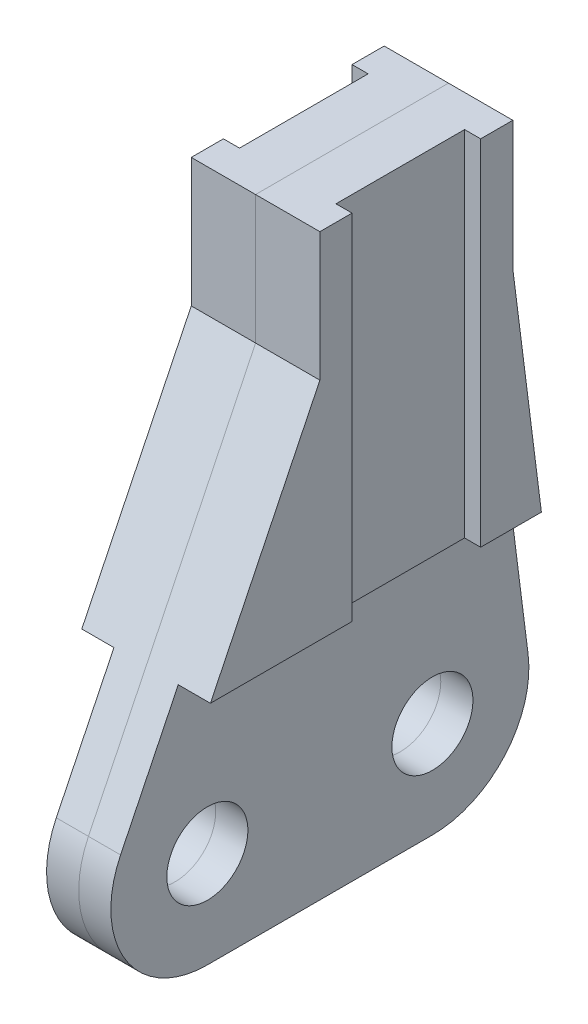
ISO-10303-21;
HEADER;
FILE_DESCRIPTION(('STEP AP214'),'2;1');
FILE_NAME('part.step','',(''),(''),'','','');
FILE_SCHEMA(('AUTOMOTIVE_DESIGN { 1 0 10303 214 1 1 1 1 }'));
ENDSEC;
DATA;
#1=APPLICATION_CONTEXT('core data for automotive mechanical design processes');
#2=APPLICATION_PROTOCOL_DEFINITION('international standard','automotive_design',2000,#1);
#3=PRODUCT_CONTEXT('',#1,'mechanical');
#4=PRODUCT('Part','Part','',(#3));
#5=PRODUCT_RELATED_PRODUCT_CATEGORY('part','',(#4));
#6=PRODUCT_DEFINITION_FORMATION('','',#4);
#7=PRODUCT_DEFINITION_CONTEXT('part definition',#1,'design');
#8=PRODUCT_DEFINITION('design','',#6,#7);
#9=PRODUCT_DEFINITION_SHAPE('','',#8);
#10=(LENGTH_UNIT() NAMED_UNIT(*) SI_UNIT(.MILLI.,.METRE.));
#11=(NAMED_UNIT(*) PLANE_ANGLE_UNIT() SI_UNIT($,.RADIAN.));
#12=(NAMED_UNIT(*) SI_UNIT($,.STERADIAN.) SOLID_ANGLE_UNIT());
#13=UNCERTAINTY_MEASURE_WITH_UNIT(LENGTH_MEASURE(1.E-05),#10,'distance_accuracy_value','');
#14=(GEOMETRIC_REPRESENTATION_CONTEXT(3) GLOBAL_UNCERTAINTY_ASSIGNED_CONTEXT((#13)) GLOBAL_UNIT_ASSIGNED_CONTEXT((#10,
#11,#12)) REPRESENTATION_CONTEXT('',''));
#15=CARTESIAN_POINT('',(0.,0.,0.));
#16=DIRECTION('',(0.,0.,1.));
#17=DIRECTION('',(1.,0.,0.));
#18=AXIS2_PLACEMENT_3D('',#15,#16,#17);
#19=CARTESIAN_POINT('',(-12.7,0.,0.));
#20=DIRECTION('',(-1.,0.,0.));
#21=DIRECTION('',(0.,0.,-1.));
#22=AXIS2_PLACEMENT_3D('',#19,#20,#21);
#23=PLANE('',#22);
#24=DIRECTION('',(0.,-1.,0.));
#25=VECTOR('',#24,1.);
#26=CARTESIAN_POINT('',(-12.7,0.,0.));
#27=LINE('',#26,#25);
#28=CARTESIAN_POINT('',(-12.7,60.3249999999986,0.));
#29=VERTEX_POINT('',#28);
#30=CARTESIAN_POINT('',(-12.7,-9.52500000000001,0.));
#31=VERTEX_POINT('',#30);
#32=EDGE_CURVE('E181',#29,#31,#27,.T.);
#33=ORIENTED_EDGE('',*,*,#32,.T.);
#34=DIRECTION('',(0.,0.,-1.));
#35=VECTOR('',#34,1.);
#36=CARTESIAN_POINT('',(-12.7,-9.52500000000001,0.));
#37=LINE('',#36,#35);
#38=CARTESIAN_POINT('',(-12.7,-9.52500000000001,27.9673826489299));
#39=VERTEX_POINT('',#38);
#40=EDGE_CURVE('E12',#39,#31,#37,.T.);
#41=ORIENTED_EDGE('',*,*,#40,.F.);
#42=DIRECTION('',(0.,-0.899290328705867,0.437352151813722));
#43=VECTOR('',#42,1.);
#44=CARTESIAN_POINT('',(-12.7,9.17784255482599,18.8716232759169));
#45=LINE('',#44,#43);
#46=CARTESIAN_POINT('',(-12.7,34.9249999999986,6.34999999999709));
#47=VERTEX_POINT('',#46);
#48=EDGE_CURVE('E227',#47,#39,#45,.T.);
#49=ORIENTED_EDGE('',*,*,#48,.F.);
#50=DIRECTION('',(0.,-1.,0.));
#51=VECTOR('',#50,1.);
#52=CARTESIAN_POINT('',(-12.7,0.,6.34999999999709));
#53=LINE('',#52,#51);
#54=CARTESIAN_POINT('',(-12.7,60.3249999999986,6.3499999999971));
#55=VERTEX_POINT('',#54);
#56=EDGE_CURVE('E224',#55,#47,#53,.T.);
#57=ORIENTED_EDGE('',*,*,#56,.F.);
#58=DIRECTION('',(0.,0.,-1.));
#59=VECTOR('',#58,1.);
#60=CARTESIAN_POINT('',(-12.7,60.3249999999986,0.));
#61=LINE('',#60,#59);
#62=EDGE_CURVE('E221',#55,#29,#61,.T.);
#63=ORIENTED_EDGE('',*,*,#62,.T.);
#64=EDGE_LOOP('',(#33,#41,#49,#57,#63));
#65=FACE_BOUND('',#64,.T.);
#66=ADVANCED_FACE('F54',(#65),#23,.T.);
#67=CARTESIAN_POINT('',(-12.7,4.52293344157861,-35.611315475034));
#68=DIRECTION('',(0.,0.125996158832205,-0.992030729342357));
#69=DIRECTION('',(0.,0.992030729342358,0.125996158832205));
#70=AXIS2_PLACEMENT_3D('',#67,#68,#69);
#71=PLANE('',#70);
#72=DIRECTION('',(0.,-0.992030729342358,-0.125996158832205));
#73=VECTOR('',#72,1.);
#74=CARTESIAN_POINT('',(-12.7,4.52293344157861,-35.611315475034));
#75=LINE('',#74,#73);
#76=CARTESIAN_POINT('',(-12.7,34.9249999999986,-31.7499999999969));
#77=VERTEX_POINT('',#76);
#78=CARTESIAN_POINT('',(-12.7,-9.52500000000001,-37.3955199364651));
#79=VERTEX_POINT('',#78);
#80=EDGE_CURVE('E214',#77,#79,#75,.T.);
#81=ORIENTED_EDGE('',*,*,#80,.F.);
#82=DIRECTION('',(1.,0.,0.));
#83=VECTOR('',#82,1.);
#84=CARTESIAN_POINT('',(-12.7,34.9249999999986,-31.7499999999969));
#85=LINE('',#84,#83);
#86=CARTESIAN_POINT('',(0.,34.9249999999986,-31.7499999999969));
#87=VERTEX_POINT('',#86);
#88=EDGE_CURVE('E268',#77,#87,#85,.T.);
#89=ORIENTED_EDGE('',*,*,#88,.T.);
#90=DIRECTION('',(0.,-0.992030729342358,-0.125996158832205));
#91=VECTOR('',#90,1.);
#92=CARTESIAN_POINT('',(0.,4.52293344157861,-35.611315475034));
#93=LINE('',#92,#91);
#94=CARTESIAN_POINT('',(0.,-38.8747731742469,-41.1231853939687));
#95=VERTEX_POINT('',#94);
#96=EDGE_CURVE('E235',#87,#95,#93,.T.);
#97=ORIENTED_EDGE('',*,*,#96,.T.);
#98=DIRECTION('',(1.,0.,0.));
#99=VECTOR('',#98,1.);
#100=CARTESIAN_POINT('',(-12.7,-38.8747731742469,-41.1231853939687));
#101=LINE('',#100,#99);
#102=CARTESIAN_POINT('',(-6.35,-38.8747731742469,-41.1231853939687));
#103=VERTEX_POINT('',#102);
#104=EDGE_CURVE('E271',#103,#95,#101,.T.);
#105=ORIENTED_EDGE('',*,*,#104,.F.);
#106=DIRECTION('',(0.,0.992030729342358,0.125996158832205));
#107=VECTOR('',#106,1.);
#108=CARTESIAN_POINT('',(-6.35,4.52293344157861,-35.611315475034));
#109=LINE('',#108,#107);
#110=CARTESIAN_POINT('',(-6.35,-9.52500000000001,-37.3955199364651));
#111=VERTEX_POINT('',#110);
#112=EDGE_CURVE('E207',#103,#111,#109,.T.);
#113=ORIENTED_EDGE('',*,*,#112,.T.);
#114=DIRECTION('',(1.,0.,0.));
#115=VECTOR('',#114,1.);
#116=CARTESIAN_POINT('',(-12.7,-9.52500000000001,-37.3955199364651));
#117=LINE('',#116,#115);
#118=EDGE_CURVE('E194',#79,#111,#117,.T.);
#119=ORIENTED_EDGE('',*,*,#118,.F.);
#120=EDGE_LOOP('',(#81,#89,#97,#105,#113,#119));
#121=FACE_BOUND('',#120,.T.);
#122=ADVANCED_FACE('F317',(#121),#71,.T.);
#123=CARTESIAN_POINT('',(-12.7,9.17784255482599,18.8716232759169));
#124=DIRECTION('',(0.,-0.437352151813722,-0.899290328705867));
#125=DIRECTION('',(0.,0.899290328705867,-0.437352151813722));
#126=AXIS2_PLACEMENT_3D('',#123,#124,#125);
#127=PLANE('',#126);
#128=DIRECTION('',(1.,0.,0.));
#129=VECTOR('',#128,1.);
#130=CARTESIAN_POINT('',(-12.7,-9.52500000000001,27.9673826489299));
#131=LINE('',#130,#129);
#132=CARTESIAN_POINT('',(-6.35,-9.52500000000002,27.9673826489299));
#133=VERTEX_POINT('',#132);
#134=EDGE_CURVE('E191',#39,#133,#131,.T.);
#135=ORIENTED_EDGE('',*,*,#134,.T.);
#136=DIRECTION('',(0.,0.899290328705867,-0.437352151813722));
#137=VECTOR('',#136,1.);
#138=CARTESIAN_POINT('',(-6.35,9.17784255482599,18.8716232759169));
#139=LINE('',#138,#137);
#140=CARTESIAN_POINT('',(-6.35,-32.94344150795,39.3564807618438));
#141=VERTEX_POINT('',#140);
#142=EDGE_CURVE('E199',#141,#133,#139,.T.);
#143=ORIENTED_EDGE('',*,*,#142,.F.);
#144=DIRECTION('',(1.,0.,0.));
#145=VECTOR('',#144,1.);
#146=CARTESIAN_POINT('',(-12.7,-32.94344150795,39.3564807618438));
#147=LINE('',#146,#145);
#148=CARTESIAN_POINT('',(0.,-32.94344150795,39.3564807618438));
#149=VERTEX_POINT('',#148);
#150=EDGE_CURVE('E256',#141,#149,#147,.T.);
#151=ORIENTED_EDGE('',*,*,#150,.T.);
#152=DIRECTION('',(0.,-0.899290328705867,0.437352151813722));
#153=VECTOR('',#152,1.);
#154=CARTESIAN_POINT('',(0.,9.17784255482599,18.8716232759169));
#155=LINE('',#154,#153);
#156=CARTESIAN_POINT('',(0.,34.9249999999986,6.34999999999709));
#157=VERTEX_POINT('',#156);
#158=EDGE_CURVE('E244',#157,#149,#155,.T.);
#159=ORIENTED_EDGE('',*,*,#158,.F.);
#160=DIRECTION('',(1.,0.,0.));
#161=VECTOR('',#160,1.);
#162=CARTESIAN_POINT('',(-12.7,34.9249999999986,6.34999999999709));
#163=LINE('',#162,#161);
#164=EDGE_CURVE('E259',#47,#157,#163,.T.);
#165=ORIENTED_EDGE('',*,*,#164,.F.);
#166=ORIENTED_EDGE('',*,*,#48,.T.);
#167=EDGE_LOOP('',(#135,#143,#151,#159,#165,#166));
#168=FACE_BOUND('',#167,.T.);
#169=ADVANCED_FACE('F323',(#168),#127,.F.);
#170=DIRECTION('',(0.,1.,0.));
#171=VECTOR('',#170,1.);
#172=CARTESIAN_POINT('',(-12.7,0.,-25.3999999999969));
#173=LINE('',#172,#171);
#174=CARTESIAN_POINT('',(-12.7,-9.52500000000001,-25.3999999999969));
#175=VERTEX_POINT('',#174);
#176=CARTESIAN_POINT('',(-12.7,60.3249999999986,-25.3999999999969));
#177=VERTEX_POINT('',#176);
#178=EDGE_CURVE('E171',#175,#177,#173,.T.);
#179=ORIENTED_EDGE('',*,*,#178,.T.);
#180=CARTESIAN_POINT('',(-12.7,60.3249999999986,-31.7499999999969));
#181=VERTEX_POINT('',#180);
#182=EDGE_CURVE('E220',#177,#181,#61,.T.);
#183=ORIENTED_EDGE('',*,*,#182,.T.);
#184=DIRECTION('',(0.,-1.,0.));
#185=VECTOR('',#184,1.);
#186=CARTESIAN_POINT('',(-12.7,0.,-31.7499999999969));
#187=LINE('',#186,#185);
#188=EDGE_CURVE('E217',#181,#77,#187,.T.);
#189=ORIENTED_EDGE('',*,*,#188,.T.);
#190=ORIENTED_EDGE('',*,*,#80,.T.);
#191=EDGE_CURVE('E63',#175,#79,#37,.T.);
#192=ORIENTED_EDGE('',*,*,#191,.F.);
#193=EDGE_LOOP('',(#179,#183,#189,#190,#192));
#194=FACE_BOUND('',#193,.T.);
#195=ADVANCED_FACE('F320',(#194),#23,.T.);
#196=CARTESIAN_POINT('',(-12.7,-60.3249999999968,0.));
#197=DIRECTION('',(0.,1.,0.));
#198=DIRECTION('',(0.,0.,1.));
#199=AXIS2_PLACEMENT_3D('',#196,#197,#198);
#200=PLANE('',#199);
#201=DIRECTION('',(1.,0.,0.));
#202=VECTOR('',#201,1.);
#203=CARTESIAN_POINT('',(-12.7,-60.3249999999968,-22.225));
#204=LINE('',#203,#202);
#205=CARTESIAN_POINT('',(-6.35,-60.3249999999968,-22.225));
#206=VERTEX_POINT('',#205);
#207=CARTESIAN_POINT('',(0.,-60.3249999999968,-22.225));
#208=VERTEX_POINT('',#207);
#209=EDGE_CURVE('E274',#206,#208,#204,.T.);
#210=ORIENTED_EDGE('',*,*,#209,.T.);
#211=DIRECTION('',(0.,0.,-1.));
#212=VECTOR('',#211,1.);
#213=CARTESIAN_POINT('',(0.,-60.3249999999968,0.));
#214=LINE('',#213,#212);
#215=CARTESIAN_POINT('',(0.,-60.3249999999968,22.225));
#216=VERTEX_POINT('',#215);
#217=EDGE_CURVE('E213',#216,#208,#214,.T.);
#218=ORIENTED_EDGE('',*,*,#217,.F.);
#219=DIRECTION('',(1.,0.,0.));
#220=VECTOR('',#219,1.);
#221=CARTESIAN_POINT('',(-12.7,-60.3249999999968,22.225));
#222=LINE('',#221,#220);
#223=CARTESIAN_POINT('',(-6.35,-60.3249999999968,22.225));
#224=VERTEX_POINT('',#223);
#225=EDGE_CURVE('E230',#224,#216,#222,.T.);
#226=ORIENTED_EDGE('',*,*,#225,.F.);
#227=DIRECTION('',(0.,0.,1.));
#228=VECTOR('',#227,1.);
#229=CARTESIAN_POINT('',(-6.35,-60.3249999999968,0.));
#230=LINE('',#229,#228);
#231=EDGE_CURVE('E202',#206,#224,#230,.T.);
#232=ORIENTED_EDGE('',*,*,#231,.F.);
#233=EDGE_LOOP('',(#210,#218,#226,#232));
#234=FACE_BOUND('',#233,.T.);
#235=ADVANCED_FACE('F56',(#234),#200,.F.);
#236=CARTESIAN_POINT('',(-12.7,-41.275,-22.2250000000001));
#237=DIRECTION('',(1.,0.,0.));
#238=DIRECTION('',(0.,0.,1.));
#239=AXIS2_PLACEMENT_3D('',#236,#237,#238);
#240=CYLINDRICAL_SURFACE('',#239,19.0499999999968);
#241=ORIENTED_EDGE('',*,*,#104,.T.);
#242=CARTESIAN_POINT('',(0.,-41.275,-22.2250000000001));
#243=DIRECTION('',(1.,0.,0.));
#244=DIRECTION('',(0.,0.,-1.));
#245=AXIS2_PLACEMENT_3D('',#242,#243,#244);
#246=CIRCLE('',#245,19.0499999999968);
#247=EDGE_CURVE('E233',#208,#95,#246,.T.);
#248=ORIENTED_EDGE('',*,*,#247,.F.);
#249=ORIENTED_EDGE('',*,*,#209,.F.);
#250=CARTESIAN_POINT('',(-6.35,-41.275,-22.2250000000001));
#251=DIRECTION('',(-1.,0.,0.));
#252=DIRECTION('',(0.,0.,1.));
#253=AXIS2_PLACEMENT_3D('',#250,#251,#252);
#254=CIRCLE('',#253,19.0499999999968);
#255=EDGE_CURVE('E205',#103,#206,#254,.T.);
#256=ORIENTED_EDGE('',*,*,#255,.F.);
#257=EDGE_LOOP('',(#241,#248,#249,#256));
#258=FACE_BOUND('',#257,.T.);
#259=ADVANCED_FACE('F332',(#258),#240,.T.);
#260=CARTESIAN_POINT('',(-12.7,0.,-31.7499999999969));
#261=DIRECTION('',(0.,0.,-1.));
#262=DIRECTION('',(1.,0.,0.));
#263=AXIS2_PLACEMENT_3D('',#260,#261,#262);
#264=PLANE('',#263);
#265=DIRECTION('',(0.,-1.,0.));
#266=VECTOR('',#265,1.);
#267=CARTESIAN_POINT('',(0.,0.,-31.7499999999969));
#268=LINE('',#267,#266);
#269=CARTESIAN_POINT('',(0.,60.3249999999986,-31.7499999999969));
#270=VERTEX_POINT('',#269);
#271=EDGE_CURVE('E238',#270,#87,#268,.T.);
#272=ORIENTED_EDGE('',*,*,#271,.T.);
#273=ORIENTED_EDGE('',*,*,#88,.F.);
#274=ORIENTED_EDGE('',*,*,#188,.F.);
#275=DIRECTION('',(1.,0.,0.));
#276=VECTOR('',#275,1.);
#277=CARTESIAN_POINT('',(-12.7,60.3249999999986,-31.7499999999969));
#278=LINE('',#277,#276);
#279=EDGE_CURVE('E265',#181,#270,#278,.T.);
#280=ORIENTED_EDGE('',*,*,#279,.T.);
#281=EDGE_LOOP('',(#272,#273,#274,#280));
#282=FACE_BOUND('',#281,.T.);
#283=ADVANCED_FACE('F360',(#282),#264,.T.);
#284=CARTESIAN_POINT('',(-12.7,60.3249999999986,0.));
#285=DIRECTION('',(0.,1.,0.));
#286=DIRECTION('',(0.,0.,1.));
#287=AXIS2_PLACEMENT_3D('',#284,#285,#286);
#288=PLANE('',#287);
#289=DIRECTION('',(-1.,0.,0.));
#290=VECTOR('',#289,1.);
#291=CARTESIAN_POINT('',(-9.525,60.3249999999986,0.));
#292=LINE('',#291,#290);
#293=CARTESIAN_POINT('',(-9.525,60.3249999999986,0.));
#294=VERTEX_POINT('',#293);
#295=EDGE_CURVE('E185',#294,#29,#292,.T.);
#296=ORIENTED_EDGE('',*,*,#295,.T.);
#297=ORIENTED_EDGE('',*,*,#62,.F.);
#298=DIRECTION('',(1.,0.,0.));
#299=VECTOR('',#298,1.);
#300=CARTESIAN_POINT('',(-12.7,60.3249999999986,6.3499999999971));
#301=LINE('',#300,#299);
#302=CARTESIAN_POINT('',(0.,60.3249999999986,6.3499999999971));
#303=VERTEX_POINT('',#302);
#304=EDGE_CURVE('E262',#55,#303,#301,.T.);
#305=ORIENTED_EDGE('',*,*,#304,.T.);
#306=DIRECTION('',(0.,0.,-1.));
#307=VECTOR('',#306,1.);
#308=CARTESIAN_POINT('',(0.,60.3249999999986,0.));
#309=LINE('',#308,#307);
#310=EDGE_CURVE('E240',#303,#270,#309,.T.);
#311=ORIENTED_EDGE('',*,*,#310,.T.);
#312=ORIENTED_EDGE('',*,*,#279,.F.);
#313=ORIENTED_EDGE('',*,*,#182,.F.);
#314=DIRECTION('',(-1.,0.,0.));
#315=VECTOR('',#314,1.);
#316=CARTESIAN_POINT('',(-9.525,60.3249999999986,-25.3999999999969));
#317=LINE('',#316,#315);
#318=CARTESIAN_POINT('',(-9.525,60.3249999999986,-25.3999999999969));
#319=VERTEX_POINT('',#318);
#320=EDGE_CURVE('E172',#319,#177,#317,.T.);
#321=ORIENTED_EDGE('',*,*,#320,.F.);
#322=DIRECTION('',(0.,0.,1.));
#323=VECTOR('',#322,1.);
#324=CARTESIAN_POINT('',(-9.525,60.3249999999986,0.));
#325=LINE('',#324,#323);
#326=EDGE_CURVE('E163',#319,#294,#325,.T.);
#327=ORIENTED_EDGE('',*,*,#326,.T.);
#328=EDGE_LOOP('',(#296,#297,#305,#311,#312,#313,#321,#327));
#329=FACE_BOUND('',#328,.T.);
#330=ADVANCED_FACE('F356',(#329),#288,.T.);
#331=CARTESIAN_POINT('',(-12.7,0.,6.34999999999709));
#332=DIRECTION('',(0.,0.,-1.));
#333=DIRECTION('',(0.,1.,0.));
#334=AXIS2_PLACEMENT_3D('',#331,#332,#333);
#335=PLANE('',#334);
#336=DIRECTION('',(0.,-1.,0.));
#337=VECTOR('',#336,1.);
#338=CARTESIAN_POINT('',(0.,0.,6.34999999999709));
#339=LINE('',#338,#337);
#340=EDGE_CURVE('E242',#303,#157,#339,.T.);
#341=ORIENTED_EDGE('',*,*,#340,.F.);
#342=ORIENTED_EDGE('',*,*,#304,.F.);
#343=ORIENTED_EDGE('',*,*,#56,.T.);
#344=ORIENTED_EDGE('',*,*,#164,.T.);
#345=EDGE_LOOP('',(#341,#342,#343,#344));
#346=FACE_BOUND('',#345,.T.);
#347=ADVANCED_FACE('F367',(#346),#335,.F.);
#348=CARTESIAN_POINT('',(-12.7,-41.275,22.225));
#349=DIRECTION('',(1.,0.,0.));
#350=DIRECTION('',(0.,0.,1.));
#351=AXIS2_PLACEMENT_3D('',#348,#349,#350);
#352=CYLINDRICAL_SURFACE('',#351,8.00099999999679);
#353=CARTESIAN_POINT('',(-6.35,-41.275,22.225));
#354=DIRECTION('',(-1.,0.,0.));
#355=DIRECTION('',(0.,0.,1.));
#356=AXIS2_PLACEMENT_3D('',#353,#354,#355);
#357=CIRCLE('',#356,8.00099999999679);
#358=CARTESIAN_POINT('',(-6.35,-41.275,30.2259999999968));
#359=VERTEX_POINT('',#358);
#360=EDGE_CURVE('E210',#359,#359,#357,.T.);
#361=ORIENTED_EDGE('',*,*,#360,.T.);
#362=EDGE_LOOP('',(#361));
#363=FACE_BOUND('',#362,.T.);
#364=CARTESIAN_POINT('',(0.,-41.275,22.225));
#365=DIRECTION('',(1.,0.,0.));
#366=DIRECTION('',(0.,0.,-1.));
#367=AXIS2_PLACEMENT_3D('',#364,#365,#366);
#368=CIRCLE('',#367,8.00099999999679);
#369=CARTESIAN_POINT('',(0.,-41.275,14.2240000000032));
#370=VERTEX_POINT('',#369);
#371=EDGE_CURVE('E249',#370,#370,#368,.T.);
#372=ORIENTED_EDGE('',*,*,#371,.T.);
#373=EDGE_LOOP('',(#372));
#374=FACE_BOUND('',#373,.T.);
#375=ADVANCED_FACE('F312',(#363,#374),#352,.F.);
#376=CARTESIAN_POINT('',(-12.7,-41.275,22.225));
#377=DIRECTION('',(1.,0.,0.));
#378=DIRECTION('',(0.,0.,1.));
#379=AXIS2_PLACEMENT_3D('',#376,#377,#378);
#380=CYLINDRICAL_SURFACE('',#379,19.0499999999968);
#381=ORIENTED_EDGE('',*,*,#225,.T.);
#382=CARTESIAN_POINT('',(0.,-41.275,22.225));
#383=DIRECTION('',(1.,0.,0.));
#384=DIRECTION('',(0.,0.,-1.));
#385=AXIS2_PLACEMENT_3D('',#382,#383,#384);
#386=CIRCLE('',#385,19.0499999999968);
#387=EDGE_CURVE('E247',#149,#216,#386,.T.);
#388=ORIENTED_EDGE('',*,*,#387,.F.);
#389=ORIENTED_EDGE('',*,*,#150,.F.);
#390=CARTESIAN_POINT('',(-6.35,-41.275,22.225));
#391=DIRECTION('',(-1.,0.,0.));
#392=DIRECTION('',(0.,0.,1.));
#393=AXIS2_PLACEMENT_3D('',#390,#391,#392);
#394=CIRCLE('',#393,19.0499999999968);
#395=EDGE_CURVE('E197',#224,#141,#394,.T.);
#396=ORIENTED_EDGE('',*,*,#395,.F.);
#397=EDGE_LOOP('',(#381,#388,#389,#396));
#398=FACE_BOUND('',#397,.T.);
#399=ADVANCED_FACE('F307',(#398),#380,.T.);
#400=CARTESIAN_POINT('',(-12.7,-41.275,-22.2250000000001));
#401=DIRECTION('',(1.,0.,0.));
#402=DIRECTION('',(0.,0.,1.));
#403=AXIS2_PLACEMENT_3D('',#400,#401,#402);
#404=CYLINDRICAL_SURFACE('',#403,8.00099999999679);
#405=CARTESIAN_POINT('',(-6.35,-41.275,-22.2250000000001));
#406=DIRECTION('',(-1.,0.,0.));
#407=DIRECTION('',(0.,0.,1.));
#408=AXIS2_PLACEMENT_3D('',#405,#406,#407);
#409=CIRCLE('',#408,8.00099999999679);
#410=CARTESIAN_POINT('',(-6.35,-41.275,-14.2240000000033));
#411=VERTEX_POINT('',#410);
#412=EDGE_CURVE('E196',#411,#411,#409,.T.);
#413=ORIENTED_EDGE('',*,*,#412,.T.);
#414=EDGE_LOOP('',(#413));
#415=FACE_BOUND('',#414,.T.);
#416=CARTESIAN_POINT('',(0.,-41.275,-22.2250000000001));
#417=DIRECTION('',(1.,0.,0.));
#418=DIRECTION('',(0.,0.,-1.));
#419=AXIS2_PLACEMENT_3D('',#416,#417,#418);
#420=CIRCLE('',#419,8.00099999999679);
#421=CARTESIAN_POINT('',(0.,-41.275,-30.2259999999968));
#422=VERTEX_POINT('',#421);
#423=EDGE_CURVE('E218',#422,#422,#420,.T.);
#424=ORIENTED_EDGE('',*,*,#423,.T.);
#425=EDGE_LOOP('',(#424));
#426=FACE_BOUND('',#425,.T.);
#427=ADVANCED_FACE('F297',(#415,#426),#404,.F.);
#428=CARTESIAN_POINT('',(0.,0.,0.));
#429=DIRECTION('',(-1.,0.,0.));
#430=DIRECTION('',(0.,0.,-1.));
#431=AXIS2_PLACEMENT_3D('',#428,#429,#430);
#432=PLANE('',#431);
#433=CARTESIAN_POINT('',(0.,9.52499999999857,-12.6999999999999));
#434=DIRECTION('',(1.,0.,0.));
#435=DIRECTION('',(0.,0.,-1.));
#436=AXIS2_PLACEMENT_3D('',#433,#434,#435);
#437=CIRCLE('',#436,6.5484375);
#438=CARTESIAN_POINT('',(0.,9.52499999999857,-19.2484374999999));
#439=VERTEX_POINT('',#438);
#440=EDGE_CURVE('E280',#439,#439,#437,.T.);
#441=ORIENTED_EDGE('',*,*,#440,.F.);
#442=EDGE_LOOP('',(#441));
#443=FACE_BOUND('',#442,.T.);
#444=CARTESIAN_POINT('',(0.,47.6249999999986,-12.6999999999999));
#445=DIRECTION('',(1.,0.,0.));
#446=DIRECTION('',(0.,0.,-1.));
#447=AXIS2_PLACEMENT_3D('',#444,#445,#446);
#448=CIRCLE('',#447,6.5484375);
#449=CARTESIAN_POINT('',(0.,47.6249999999986,-19.2484374999999));
#450=VERTEX_POINT('',#449);
#451=EDGE_CURVE('E285',#450,#450,#448,.T.);
#452=ORIENTED_EDGE('',*,*,#451,.F.);
#453=EDGE_LOOP('',(#452));
#454=FACE_BOUND('',#453,.T.);
#455=ORIENTED_EDGE('',*,*,#217,.T.);
#456=ORIENTED_EDGE('',*,*,#247,.T.);
#457=ORIENTED_EDGE('',*,*,#96,.F.);
#458=ORIENTED_EDGE('',*,*,#271,.F.);
#459=ORIENTED_EDGE('',*,*,#310,.F.);
#460=ORIENTED_EDGE('',*,*,#340,.T.);
#461=ORIENTED_EDGE('',*,*,#158,.T.);
#462=ORIENTED_EDGE('',*,*,#387,.T.);
#463=EDGE_LOOP('',(#455,#456,#457,#458,#459,#460,#461,#462));
#464=FACE_BOUND('',#463,.T.);
#465=ORIENTED_EDGE('',*,*,#371,.F.);
#466=EDGE_LOOP('',(#465));
#467=FACE_BOUND('',#466,.T.);
#468=ORIENTED_EDGE('',*,*,#423,.F.);
#469=EDGE_LOOP('',(#468));
#470=FACE_BOUND('',#469,.T.);
#471=ADVANCED_FACE('F294',(#443,#454,#464,#467,#470),#432,.F.);
#472=CARTESIAN_POINT('',(-6.35,-9.52500000000001,63.9630765571107));
#473=DIRECTION('',(0.,-1.,0.));
#474=DIRECTION('',(0.,0.,-1.));
#475=AXIS2_PLACEMENT_3D('',#472,#473,#474);
#476=PLANE('',#475);
#477=DIRECTION('',(-1.,0.,0.));
#478=VECTOR('',#477,1.);
#479=CARTESIAN_POINT('',(-9.525,-9.52500000000001,0.));
#480=LINE('',#479,#478);
#481=CARTESIAN_POINT('',(-9.525,-9.52500000000001,0.));
#482=VERTEX_POINT('',#481);
#483=EDGE_CURVE('E173',#482,#31,#480,.T.);
#484=ORIENTED_EDGE('',*,*,#483,.F.);
#485=DIRECTION('',(0.,0.,-1.));
#486=VECTOR('',#485,1.);
#487=CARTESIAN_POINT('',(-9.525,-9.52500000000001,0.));
#488=LINE('',#487,#486);
#489=CARTESIAN_POINT('',(-9.525,-9.52500000000001,-25.3999999999969));
#490=VERTEX_POINT('',#489);
#491=EDGE_CURVE('E160',#482,#490,#488,.T.);
#492=ORIENTED_EDGE('',*,*,#491,.T.);
#493=DIRECTION('',(-1.,0.,0.));
#494=VECTOR('',#493,1.);
#495=CARTESIAN_POINT('',(-9.525,-9.52500000000001,-25.3999999999969));
#496=LINE('',#495,#494);
#497=EDGE_CURVE('E168',#490,#175,#496,.T.);
#498=ORIENTED_EDGE('',*,*,#497,.T.);
#499=ORIENTED_EDGE('',*,*,#191,.T.);
#500=ORIENTED_EDGE('',*,*,#118,.T.);
#501=DIRECTION('',(0.,0.,-1.));
#502=VECTOR('',#501,1.);
#503=CARTESIAN_POINT('',(-6.35,-9.52500000000001,63.9630765571107));
#504=LINE('',#503,#502);
#505=EDGE_CURVE('E187',#133,#111,#504,.T.);
#506=ORIENTED_EDGE('',*,*,#505,.F.);
#507=ORIENTED_EDGE('',*,*,#134,.F.);
#508=ORIENTED_EDGE('',*,*,#40,.T.);
#509=EDGE_LOOP('',(#484,#492,#498,#499,#500,#506,#507,#508));
#510=FACE_BOUND('',#509,.T.);
#511=ADVANCED_FACE('F175',(#510),#476,.T.);
#512=CARTESIAN_POINT('',(-6.35,0.,0.));
#513=DIRECTION('',(1.,0.,0.));
#514=DIRECTION('',(0.,0.,1.));
#515=AXIS2_PLACEMENT_3D('',#512,#513,#514);
#516=PLANE('',#515);
#517=ORIENTED_EDGE('',*,*,#360,.F.);
#518=EDGE_LOOP('',(#517));
#519=FACE_BOUND('',#518,.T.);
#520=ORIENTED_EDGE('',*,*,#112,.F.);
#521=ORIENTED_EDGE('',*,*,#255,.T.);
#522=ORIENTED_EDGE('',*,*,#231,.T.);
#523=ORIENTED_EDGE('',*,*,#395,.T.);
#524=ORIENTED_EDGE('',*,*,#142,.T.);
#525=ORIENTED_EDGE('',*,*,#505,.T.);
#526=EDGE_LOOP('',(#520,#521,#522,#523,#524,#525));
#527=FACE_BOUND('',#526,.T.);
#528=ORIENTED_EDGE('',*,*,#412,.F.);
#529=EDGE_LOOP('',(#528));
#530=FACE_BOUND('',#529,.T.);
#531=ADVANCED_FACE('F345',(#519,#527,#530),#516,.F.);
#532=CARTESIAN_POINT('',(-9.525,0.,0.));
#533=DIRECTION('',(0.,0.,1.));
#534=DIRECTION('',(0.,-1.,0.));
#535=AXIS2_PLACEMENT_3D('',#532,#533,#534);
#536=PLANE('',#535);
#537=ORIENTED_EDGE('',*,*,#32,.F.);
#538=ORIENTED_EDGE('',*,*,#295,.F.);
#539=DIRECTION('',(0.,-1.,0.));
#540=VECTOR('',#539,1.);
#541=CARTESIAN_POINT('',(-9.525,0.,0.));
#542=LINE('',#541,#540);
#543=EDGE_CURVE('E71',#294,#482,#542,.T.);
#544=ORIENTED_EDGE('',*,*,#543,.T.);
#545=ORIENTED_EDGE('',*,*,#483,.T.);
#546=EDGE_LOOP('',(#537,#538,#544,#545));
#547=FACE_BOUND('',#546,.T.);
#548=ADVANCED_FACE('F354',(#547),#536,.F.);
#549=CARTESIAN_POINT('',(-9.525,0.,-25.3999999999969));
#550=DIRECTION('',(0.,0.,-1.));
#551=DIRECTION('',(1.,0.,0.));
#552=AXIS2_PLACEMENT_3D('',#549,#550,#551);
#553=PLANE('',#552);
#554=ORIENTED_EDGE('',*,*,#178,.F.);
#555=ORIENTED_EDGE('',*,*,#497,.F.);
#556=DIRECTION('',(0.,1.,0.));
#557=VECTOR('',#556,1.);
#558=CARTESIAN_POINT('',(-9.525,0.,-25.3999999999969));
#559=LINE('',#558,#557);
#560=EDGE_CURVE('E156',#490,#319,#559,.T.);
#561=ORIENTED_EDGE('',*,*,#560,.T.);
#562=ORIENTED_EDGE('',*,*,#320,.T.);
#563=EDGE_LOOP('',(#554,#555,#561,#562));
#564=FACE_BOUND('',#563,.T.);
#565=ADVANCED_FACE('F169',(#564),#553,.F.);
#566=CARTESIAN_POINT('',(-9.525,0.,0.));
#567=DIRECTION('',(-1.,0.,0.));
#568=DIRECTION('',(0.,0.,-1.));
#569=AXIS2_PLACEMENT_3D('',#566,#567,#568);
#570=PLANE('',#569);
#571=CARTESIAN_POINT('',(-9.525,9.52499999999857,-12.6999999999999));
#572=DIRECTION('',(-1.,0.,0.));
#573=DIRECTION('',(0.,0.,1.));
#574=AXIS2_PLACEMENT_3D('',#571,#572,#573);
#575=CIRCLE('',#574,6.5484375);
#576=CARTESIAN_POINT('',(-9.525,9.52499999999857,-6.15156249999994));
#577=VERTEX_POINT('',#576);
#578=EDGE_CURVE('E58',#577,#577,#575,.T.);
#579=ORIENTED_EDGE('',*,*,#578,.F.);
#580=EDGE_LOOP('',(#579));
#581=FACE_BOUND('',#580,.T.);
#582=CARTESIAN_POINT('',(-9.525,47.6249999999986,-12.6999999999999));
#583=DIRECTION('',(-1.,0.,0.));
#584=DIRECTION('',(0.,0.,1.));
#585=AXIS2_PLACEMENT_3D('',#582,#583,#584);
#586=CIRCLE('',#585,6.5484375);
#587=CARTESIAN_POINT('',(-9.525,47.6249999999986,-6.15156249999993));
#588=VERTEX_POINT('',#587);
#589=EDGE_CURVE('E278',#588,#588,#586,.T.);
#590=ORIENTED_EDGE('',*,*,#589,.F.);
#591=EDGE_LOOP('',(#590));
#592=FACE_BOUND('',#591,.T.);
#593=ORIENTED_EDGE('',*,*,#543,.F.);
#594=ORIENTED_EDGE('',*,*,#326,.F.);
#595=ORIENTED_EDGE('',*,*,#560,.F.);
#596=ORIENTED_EDGE('',*,*,#491,.F.);
#597=EDGE_LOOP('',(#593,#594,#595,#596));
#598=FACE_BOUND('',#597,.T.);
#599=ADVANCED_FACE('F158',(#581,#592,#598),#570,.T.);
#600=CARTESIAN_POINT('',(-12.7,47.6249999999986,-12.6999999999999));
#601=DIRECTION('',(1.,0.,0.));
#602=DIRECTION('',(0.,0.,-1.));
#603=AXIS2_PLACEMENT_3D('',#600,#601,#602);
#604=CYLINDRICAL_SURFACE('',#603,6.5484375);
#605=ORIENTED_EDGE('',*,*,#589,.T.);
#606=EDGE_LOOP('',(#605));
#607=FACE_BOUND('',#606,.T.);
#608=ORIENTED_EDGE('',*,*,#451,.T.);
#609=EDGE_LOOP('',(#608));
#610=FACE_BOUND('',#609,.T.);
#611=ADVANCED_FACE('F292',(#607,#610),#604,.F.);
#612=CARTESIAN_POINT('',(-12.7,9.52499999999857,-12.6999999999999));
#613=DIRECTION('',(1.,0.,0.));
#614=DIRECTION('',(0.,0.,-1.));
#615=AXIS2_PLACEMENT_3D('',#612,#613,#614);
#616=CYLINDRICAL_SURFACE('',#615,6.5484375);
#617=ORIENTED_EDGE('',*,*,#578,.T.);
#618=EDGE_LOOP('',(#617));
#619=FACE_BOUND('',#618,.T.);
#620=ORIENTED_EDGE('',*,*,#440,.T.);
#621=EDGE_LOOP('',(#620));
#622=FACE_BOUND('',#621,.T.);
#623=ADVANCED_FACE('F460',(#619,#622),#616,.F.);
#624=CLOSED_SHELL('',(#66,#122,#169,#195,#235,#259,#283,#330,#347,#375,#399,#427,#471,#511,#531,
#548,#565,#599,#611,#623));
#625=MANIFOLD_SOLID_BREP('B2',#624);
#626=CARTESIAN_POINT('',(12.7,0.,0.));
#627=DIRECTION('',(1.,0.,0.));
#628=DIRECTION('',(0.,0.,-1.));
#629=AXIS2_PLACEMENT_3D('',#626,#627,#628);
#630=PLANE('',#629);
#631=DIRECTION('',(0.,-1.,0.));
#632=VECTOR('',#631,1.);
#633=CARTESIAN_POINT('',(12.7,0.,0.));
#634=LINE('',#633,#632);
#635=CARTESIAN_POINT('',(12.7,60.3249999999986,0.));
#636=VERTEX_POINT('',#635);
#637=CARTESIAN_POINT('',(12.7,-9.52500000000001,0.));
#638=VERTEX_POINT('',#637);
#639=EDGE_CURVE('E815',#636,#638,#634,.T.);
#640=ORIENTED_EDGE('',*,*,#639,.F.);
#641=DIRECTION('',(0.,0.,-1.));
#642=VECTOR('',#641,1.);
#643=CARTESIAN_POINT('',(12.7,60.3249999999986,0.));
#644=LINE('',#643,#642);
#645=CARTESIAN_POINT('',(12.7,60.3249999999986,6.3499999999971));
#646=VERTEX_POINT('',#645);
#647=EDGE_CURVE('E719',#646,#636,#644,.T.);
#648=ORIENTED_EDGE('',*,*,#647,.F.);
#649=DIRECTION('',(0.,-1.,0.));
#650=VECTOR('',#649,1.);
#651=CARTESIAN_POINT('',(12.7,0.,6.34999999999709));
#652=LINE('',#651,#650);
#653=CARTESIAN_POINT('',(12.7,34.9249999999986,6.34999999999709));
#654=VERTEX_POINT('',#653);
#655=EDGE_CURVE('E722',#646,#654,#652,.T.);
#656=ORIENTED_EDGE('',*,*,#655,.T.);
#657=DIRECTION('',(0.,-0.899290328705867,0.437352151813722));
#658=VECTOR('',#657,1.);
#659=CARTESIAN_POINT('',(12.7,9.17784255482599,18.8716232759169));
#660=LINE('',#659,#658);
#661=CARTESIAN_POINT('',(12.7,-9.52500000000001,27.9673826489299));
#662=VERTEX_POINT('',#661);
#663=EDGE_CURVE('E724',#654,#662,#660,.T.);
#664=ORIENTED_EDGE('',*,*,#663,.T.);
#665=DIRECTION('',(0.,0.,-1.));
#666=VECTOR('',#665,1.);
#667=CARTESIAN_POINT('',(12.7,-9.52500000000001,0.));
#668=LINE('',#667,#666);
#669=EDGE_CURVE('E52',#662,#638,#668,.T.);
#670=ORIENTED_EDGE('',*,*,#669,.T.);
#671=EDGE_LOOP('',(#640,#648,#656,#664,#670));
#672=FACE_BOUND('',#671,.T.);
#673=ADVANCED_FACE('F559',(#672),#630,.T.);
#674=CARTESIAN_POINT('',(12.7,4.52293344157861,-35.611315475034));
#675=DIRECTION('',(0.,0.125996158832205,-0.992030729342357));
#676=DIRECTION('',(0.,0.992030729342358,0.125996158832205));
#677=AXIS2_PLACEMENT_3D('',#674,#675,#676);
#678=PLANE('',#677);
#679=DIRECTION('',(0.,-0.992030729342358,-0.125996158832205));
#680=VECTOR('',#679,1.);
#681=CARTESIAN_POINT('',(12.7,4.52293344157861,-35.611315475034));
#682=LINE('',#681,#680);
#683=CARTESIAN_POINT('',(12.7,34.9249999999986,-31.7499999999969));
#684=VERTEX_POINT('',#683);
#685=CARTESIAN_POINT('',(12.7,-9.52500000000001,-37.3955199364651));
#686=VERTEX_POINT('',#685);
#687=EDGE_CURVE('E711',#684,#686,#682,.T.);
#688=ORIENTED_EDGE('',*,*,#687,.T.);
#689=DIRECTION('',(-1.,0.,0.));
#690=VECTOR('',#689,1.);
#691=CARTESIAN_POINT('',(12.7,-9.52500000000001,-37.3955199364651));
#692=LINE('',#691,#690);
#693=CARTESIAN_POINT('',(6.35,-9.52500000000001,-37.3955199364651));
#694=VERTEX_POINT('',#693);
#695=EDGE_CURVE('E690',#686,#694,#692,.T.);
#696=ORIENTED_EDGE('',*,*,#695,.T.);
#697=DIRECTION('',(0.,0.992030729342358,0.125996158832205));
#698=VECTOR('',#697,1.);
#699=CARTESIAN_POINT('',(6.35,4.52293344157861,-35.611315475034));
#700=LINE('',#699,#698);
#701=CARTESIAN_POINT('',(6.35,-38.8747731742469,-41.1231853939687));
#702=VERTEX_POINT('',#701);
#703=EDGE_CURVE('E705',#702,#694,#700,.T.);
#704=ORIENTED_EDGE('',*,*,#703,.F.);
#705=DIRECTION('',(-1.,0.,0.));
#706=VECTOR('',#705,1.);
#707=CARTESIAN_POINT('',(12.7,-38.8747731742469,-41.1231853939687));
#708=LINE('',#707,#706);
#709=CARTESIAN_POINT('',(0.,-38.8747731742469,-41.1231853939687));
#710=VERTEX_POINT('',#709);
#711=EDGE_CURVE('E767',#702,#710,#708,.T.);
#712=ORIENTED_EDGE('',*,*,#711,.T.);
#713=DIRECTION('',(0.,-0.992030729342358,-0.125996158832205));
#714=VECTOR('',#713,1.);
#715=CARTESIAN_POINT('',(0.,4.52293344157861,-35.611315475034));
#716=LINE('',#715,#714);
#717=CARTESIAN_POINT('',(0.,34.9249999999986,-31.7499999999969));
#718=VERTEX_POINT('',#717);
#719=EDGE_CURVE('E733',#718,#710,#716,.T.);
#720=ORIENTED_EDGE('',*,*,#719,.F.);
#721=DIRECTION('',(-1.,0.,0.));
#722=VECTOR('',#721,1.);
#723=CARTESIAN_POINT('',(12.7,34.9249999999986,-31.7499999999969));
#724=LINE('',#723,#722);
#725=EDGE_CURVE('E765',#684,#718,#724,.T.);
#726=ORIENTED_EDGE('',*,*,#725,.F.);
#727=EDGE_LOOP('',(#688,#696,#704,#712,#720,#726));
#728=FACE_BOUND('',#727,.T.);
#729=ADVANCED_FACE('F807',(#728),#678,.T.);
#730=CARTESIAN_POINT('',(12.7,9.17784255482599,18.8716232759169));
#731=DIRECTION('',(0.,-0.437352151813722,-0.899290328705867));
#732=DIRECTION('',(0.,0.899290328705867,-0.437352151813722));
#733=AXIS2_PLACEMENT_3D('',#730,#731,#732);
#734=PLANE('',#733);
#735=DIRECTION('',(-1.,0.,0.));
#736=VECTOR('',#735,1.);
#737=CARTESIAN_POINT('',(12.7,-9.52500000000001,27.9673826489299));
#738=LINE('',#737,#736);
#739=CARTESIAN_POINT('',(6.35,-9.52500000000002,27.9673826489299));
#740=VERTEX_POINT('',#739);
#741=EDGE_CURVE('E688',#662,#740,#738,.T.);
#742=ORIENTED_EDGE('',*,*,#741,.F.);
#743=ORIENTED_EDGE('',*,*,#663,.F.);
#744=DIRECTION('',(-1.,0.,0.));
#745=VECTOR('',#744,1.);
#746=CARTESIAN_POINT('',(12.7,34.9249999999986,6.34999999999709));
#747=LINE('',#746,#745);
#748=CARTESIAN_POINT('',(0.,34.9249999999986,6.34999999999709));
#749=VERTEX_POINT('',#748);
#750=EDGE_CURVE('E758',#654,#749,#747,.T.);
#751=ORIENTED_EDGE('',*,*,#750,.T.);
#752=DIRECTION('',(0.,-0.899290328705867,0.437352151813722));
#753=VECTOR('',#752,1.);
#754=CARTESIAN_POINT('',(0.,9.17784255482599,18.8716232759169));
#755=LINE('',#754,#753);
#756=CARTESIAN_POINT('',(0.,-32.94344150795,39.3564807618438));
#757=VERTEX_POINT('',#756);
#758=EDGE_CURVE('E744',#749,#757,#755,.T.);
#759=ORIENTED_EDGE('',*,*,#758,.T.);
#760=DIRECTION('',(-1.,0.,0.));
#761=VECTOR('',#760,1.);
#762=CARTESIAN_POINT('',(12.7,-32.94344150795,39.3564807618438));
#763=LINE('',#762,#761);
#764=CARTESIAN_POINT('',(6.35,-32.94344150795,39.3564807618438));
#765=VERTEX_POINT('',#764);
#766=EDGE_CURVE('E756',#765,#757,#763,.T.);
#767=ORIENTED_EDGE('',*,*,#766,.F.);
#768=DIRECTION('',(0.,0.899290328705867,-0.437352151813722));
#769=VECTOR('',#768,1.);
#770=CARTESIAN_POINT('',(6.35,9.17784255482599,18.8716232759169));
#771=LINE('',#770,#769);
#772=EDGE_CURVE('E696',#765,#740,#771,.T.);
#773=ORIENTED_EDGE('',*,*,#772,.T.);
#774=EDGE_LOOP('',(#742,#743,#751,#759,#767,#773));
#775=FACE_BOUND('',#774,.T.);
#776=ADVANCED_FACE('F791',(#775),#734,.F.);
#777=DIRECTION('',(0.,1.,0.));
#778=VECTOR('',#777,1.);
#779=CARTESIAN_POINT('',(12.7,0.,-25.3999999999969));
#780=LINE('',#779,#778);
#781=CARTESIAN_POINT('',(12.7,-9.52500000000001,-25.3999999999969));
#782=VERTEX_POINT('',#781);
#783=CARTESIAN_POINT('',(12.7,60.3249999999986,-25.3999999999969));
#784=VERTEX_POINT('',#783);
#785=EDGE_CURVE('E817',#782,#784,#780,.T.);
#786=ORIENTED_EDGE('',*,*,#785,.F.);
#787=EDGE_CURVE('E568',#782,#686,#668,.T.);
#788=ORIENTED_EDGE('',*,*,#787,.T.);
#789=ORIENTED_EDGE('',*,*,#687,.F.);
#790=DIRECTION('',(0.,-1.,0.));
#791=VECTOR('',#790,1.);
#792=CARTESIAN_POINT('',(12.7,0.,-31.7499999999969));
#793=LINE('',#792,#791);
#794=CARTESIAN_POINT('',(12.7,60.3249999999986,-31.7499999999969));
#795=VERTEX_POINT('',#794);
#796=EDGE_CURVE('E714',#795,#684,#793,.T.);
#797=ORIENTED_EDGE('',*,*,#796,.F.);
#798=EDGE_CURVE('E718',#784,#795,#644,.T.);
#799=ORIENTED_EDGE('',*,*,#798,.F.);
#800=EDGE_LOOP('',(#786,#788,#789,#797,#799));
#801=FACE_BOUND('',#800,.T.);
#802=ADVANCED_FACE('F823',(#801),#630,.T.);
#803=CARTESIAN_POINT('',(12.7,-60.3249999999968,0.));
#804=DIRECTION('',(0.,1.,0.));
#805=DIRECTION('',(0.,0.,1.));
#806=AXIS2_PLACEMENT_3D('',#803,#804,#805);
#807=PLANE('',#806);
#808=DIRECTION('',(-1.,0.,0.));
#809=VECTOR('',#808,1.);
#810=CARTESIAN_POINT('',(12.7,-60.3249999999968,-22.225));
#811=LINE('',#810,#809);
#812=CARTESIAN_POINT('',(6.35,-60.3249999999968,-22.225));
#813=VERTEX_POINT('',#812);
#814=CARTESIAN_POINT('',(0.,-60.3249999999968,-22.225));
#815=VERTEX_POINT('',#814);
#816=EDGE_CURVE('E769',#813,#815,#811,.T.);
#817=ORIENTED_EDGE('',*,*,#816,.F.);
#818=DIRECTION('',(0.,0.,1.));
#819=VECTOR('',#818,1.);
#820=CARTESIAN_POINT('',(6.35,-60.3249999999968,0.));
#821=LINE('',#820,#819);
#822=CARTESIAN_POINT('',(6.35,-60.3249999999968,22.225));
#823=VERTEX_POINT('',#822);
#824=EDGE_CURVE('E699',#813,#823,#821,.T.);
#825=ORIENTED_EDGE('',*,*,#824,.T.);
#826=DIRECTION('',(-1.,0.,0.));
#827=VECTOR('',#826,1.);
#828=CARTESIAN_POINT('',(12.7,-60.3249999999968,22.225));
#829=LINE('',#828,#827);
#830=CARTESIAN_POINT('',(0.,-60.3249999999968,22.225));
#831=VERTEX_POINT('',#830);
#832=EDGE_CURVE('E727',#823,#831,#829,.T.);
#833=ORIENTED_EDGE('',*,*,#832,.T.);
#834=DIRECTION('',(0.,0.,-1.));
#835=VECTOR('',#834,1.);
#836=CARTESIAN_POINT('',(0.,-60.3249999999968,0.));
#837=LINE('',#836,#835);
#838=EDGE_CURVE('E710',#831,#815,#837,.T.);
#839=ORIENTED_EDGE('',*,*,#838,.T.);
#840=EDGE_LOOP('',(#817,#825,#833,#839));
#841=FACE_BOUND('',#840,.T.);
#842=ADVANCED_FACE('F561',(#841),#807,.F.);
#843=CARTESIAN_POINT('',(12.7,-41.275,-22.2250000000001));
#844=DIRECTION('',(-1.,0.,0.));
#845=DIRECTION('',(0.,0.,1.));
#846=AXIS2_PLACEMENT_3D('',#843,#844,#845);
#847=CYLINDRICAL_SURFACE('',#846,19.0499999999968);
#848=ORIENTED_EDGE('',*,*,#711,.F.);
#849=CARTESIAN_POINT('',(6.35,-41.275,-22.2250000000001));
#850=DIRECTION('',(-1.,0.,0.));
#851=DIRECTION('',(0.,0.,1.));
#852=AXIS2_PLACEMENT_3D('',#849,#850,#851);
#853=CIRCLE('',#852,19.0499999999968);
#854=EDGE_CURVE('E702',#702,#813,#853,.T.);
#855=ORIENTED_EDGE('',*,*,#854,.T.);
#856=ORIENTED_EDGE('',*,*,#816,.T.);
#857=CARTESIAN_POINT('',(0.,-41.275,-22.2250000000001));
#858=DIRECTION('',(1.,0.,0.));
#859=DIRECTION('',(0.,0.,-1.));
#860=AXIS2_PLACEMENT_3D('',#857,#858,#859);
#861=CIRCLE('',#860,19.0499999999968);
#862=EDGE_CURVE('E730',#815,#710,#861,.T.);
#863=ORIENTED_EDGE('',*,*,#862,.T.);
#864=EDGE_LOOP('',(#848,#855,#856,#863));
#865=FACE_BOUND('',#864,.T.);
#866=ADVANCED_FACE('F774',(#865),#847,.T.);
#867=CARTESIAN_POINT('',(12.7,0.,-31.7499999999969));
#868=DIRECTION('',(0.,0.,-1.));
#869=DIRECTION('',(-1.,0.,0.));
#870=AXIS2_PLACEMENT_3D('',#867,#868,#869);
#871=PLANE('',#870);
#872=DIRECTION('',(0.,-1.,0.));
#873=VECTOR('',#872,1.);
#874=CARTESIAN_POINT('',(0.,0.,-31.7499999999969));
#875=LINE('',#874,#873);
#876=CARTESIAN_POINT('',(0.,60.3249999999986,-31.7499999999969));
#877=VERTEX_POINT('',#876);
#878=EDGE_CURVE('E736',#877,#718,#875,.T.);
#879=ORIENTED_EDGE('',*,*,#878,.F.);
#880=DIRECTION('',(-1.,0.,0.));
#881=VECTOR('',#880,1.);
#882=CARTESIAN_POINT('',(12.7,60.3249999999986,-31.7499999999969));
#883=LINE('',#882,#881);
#884=EDGE_CURVE('E763',#795,#877,#883,.T.);
#885=ORIENTED_EDGE('',*,*,#884,.F.);
#886=ORIENTED_EDGE('',*,*,#796,.T.);
#887=ORIENTED_EDGE('',*,*,#725,.T.);
#888=EDGE_LOOP('',(#879,#885,#886,#887));
#889=FACE_BOUND('',#888,.T.);
#890=ADVANCED_FACE('F804',(#889),#871,.T.);
#891=CARTESIAN_POINT('',(12.7,60.3249999999986,0.));
#892=DIRECTION('',(0.,1.,0.));
#893=DIRECTION('',(0.,0.,1.));
#894=AXIS2_PLACEMENT_3D('',#891,#892,#893);
#895=PLANE('',#894);
#896=DIRECTION('',(1.,0.,0.));
#897=VECTOR('',#896,1.);
#898=CARTESIAN_POINT('',(9.525,60.3249999999986,0.));
#899=LINE('',#898,#897);
#900=CARTESIAN_POINT('',(9.525,60.3249999999986,0.));
#901=VERTEX_POINT('',#900);
#902=EDGE_CURVE('E680',#901,#636,#899,.T.);
#903=ORIENTED_EDGE('',*,*,#902,.F.);
#904=DIRECTION('',(0.,0.,1.));
#905=VECTOR('',#904,1.);
#906=CARTESIAN_POINT('',(9.525,60.3249999999986,0.));
#907=LINE('',#906,#905);
#908=CARTESIAN_POINT('',(9.525,60.3249999999986,-25.3999999999969));
#909=VERTEX_POINT('',#908);
#910=EDGE_CURVE('E669',#909,#901,#907,.T.);
#911=ORIENTED_EDGE('',*,*,#910,.F.);
#912=DIRECTION('',(1.,0.,0.));
#913=VECTOR('',#912,1.);
#914=CARTESIAN_POINT('',(9.525,60.3249999999986,-25.3999999999969));
#915=LINE('',#914,#913);
#916=EDGE_CURVE('E667',#909,#784,#915,.T.);
#917=ORIENTED_EDGE('',*,*,#916,.T.);
#918=ORIENTED_EDGE('',*,*,#798,.T.);
#919=ORIENTED_EDGE('',*,*,#884,.T.);
#920=DIRECTION('',(0.,0.,-1.));
#921=VECTOR('',#920,1.);
#922=CARTESIAN_POINT('',(0.,60.3249999999986,0.));
#923=LINE('',#922,#921);
#924=CARTESIAN_POINT('',(0.,60.3249999999986,6.3499999999971));
#925=VERTEX_POINT('',#924);
#926=EDGE_CURVE('E739',#925,#877,#923,.T.);
#927=ORIENTED_EDGE('',*,*,#926,.F.);
#928=DIRECTION('',(-1.,0.,0.));
#929=VECTOR('',#928,1.);
#930=CARTESIAN_POINT('',(12.7,60.3249999999986,6.3499999999971));
#931=LINE('',#930,#929);
#932=EDGE_CURVE('E761',#646,#925,#931,.T.);
#933=ORIENTED_EDGE('',*,*,#932,.F.);
#934=ORIENTED_EDGE('',*,*,#647,.T.);
#935=EDGE_LOOP('',(#903,#911,#917,#918,#919,#927,#933,#934));
#936=FACE_BOUND('',#935,.T.);
#937=ADVANCED_FACE('F800',(#936),#895,.T.);
#938=CARTESIAN_POINT('',(12.7,0.,6.34999999999709));
#939=DIRECTION('',(0.,0.,-1.));
#940=DIRECTION('',(0.,1.,0.));
#941=AXIS2_PLACEMENT_3D('',#938,#939,#940);
#942=PLANE('',#941);
#943=DIRECTION('',(0.,-1.,0.));
#944=VECTOR('',#943,1.);
#945=CARTESIAN_POINT('',(0.,0.,6.34999999999709));
#946=LINE('',#945,#944);
#947=EDGE_CURVE('E742',#925,#749,#946,.T.);
#948=ORIENTED_EDGE('',*,*,#947,.T.);
#949=ORIENTED_EDGE('',*,*,#750,.F.);
#950=ORIENTED_EDGE('',*,*,#655,.F.);
#951=ORIENTED_EDGE('',*,*,#932,.T.);
#952=EDGE_LOOP('',(#948,#949,#950,#951));
#953=FACE_BOUND('',#952,.T.);
#954=ADVANCED_FACE('F796',(#953),#942,.F.);
#955=CARTESIAN_POINT('',(12.7,-41.275,22.225));
#956=DIRECTION('',(-1.,0.,0.));
#957=DIRECTION('',(0.,0.,1.));
#958=AXIS2_PLACEMENT_3D('',#955,#956,#957);
#959=CYLINDRICAL_SURFACE('',#958,8.00099999999679);
#960=CARTESIAN_POINT('',(6.35,-41.275,22.225));
#961=DIRECTION('',(-1.,0.,0.));
#962=DIRECTION('',(0.,0.,1.));
#963=AXIS2_PLACEMENT_3D('',#960,#961,#962);
#964=CIRCLE('',#963,8.00099999999679);
#965=CARTESIAN_POINT('',(6.35,-41.275,30.2259999999968));
#966=VERTEX_POINT('',#965);
#967=EDGE_CURVE('E707',#966,#966,#964,.T.);
#968=ORIENTED_EDGE('',*,*,#967,.F.);
#969=EDGE_LOOP('',(#968));
#970=FACE_BOUND('',#969,.T.);
#971=CARTESIAN_POINT('',(0.,-41.275,22.225));
#972=DIRECTION('',(1.,0.,0.));
#973=DIRECTION('',(0.,0.,-1.));
#974=AXIS2_PLACEMENT_3D('',#971,#972,#973);
#975=CIRCLE('',#974,8.00099999999679);
#976=CARTESIAN_POINT('',(0.,-41.275,14.2240000000032));
#977=VERTEX_POINT('',#976);
#978=EDGE_CURVE('E750',#977,#977,#975,.T.);
#979=ORIENTED_EDGE('',*,*,#978,.F.);
#980=EDGE_LOOP('',(#979));
#981=FACE_BOUND('',#980,.T.);
#982=ADVANCED_FACE('F852',(#970,#981),#959,.F.);
#983=CARTESIAN_POINT('',(12.7,-41.275,22.225));
#984=DIRECTION('',(-1.,0.,0.));
#985=DIRECTION('',(0.,0.,1.));
#986=AXIS2_PLACEMENT_3D('',#983,#984,#985);
#987=CYLINDRICAL_SURFACE('',#986,19.0499999999968);
#988=ORIENTED_EDGE('',*,*,#832,.F.);
#989=CARTESIAN_POINT('',(6.35,-41.275,22.225));
#990=DIRECTION('',(-1.,0.,0.));
#991=DIRECTION('',(0.,0.,1.));
#992=AXIS2_PLACEMENT_3D('',#989,#990,#991);
#993=CIRCLE('',#992,19.0499999999968);
#994=EDGE_CURVE('E693',#823,#765,#993,.T.);
#995=ORIENTED_EDGE('',*,*,#994,.T.);
#996=ORIENTED_EDGE('',*,*,#766,.T.);
#997=CARTESIAN_POINT('',(0.,-41.275,22.225));
#998=DIRECTION('',(1.,0.,0.));
#999=DIRECTION('',(0.,0.,-1.));
#1000=AXIS2_PLACEMENT_3D('',#997,#998,#999);
#1001=CIRCLE('',#1000,19.0499999999968);
#1002=EDGE_CURVE('E747',#757,#831,#1001,.T.);
#1003=ORIENTED_EDGE('',*,*,#1002,.T.);
#1004=EDGE_LOOP('',(#988,#995,#996,#1003));
#1005=FACE_BOUND('',#1004,.T.);
#1006=ADVANCED_FACE('F784',(#1005),#987,.T.);
#1007=CARTESIAN_POINT('',(12.7,-41.275,-22.2250000000001));
#1008=DIRECTION('',(-1.,0.,0.));
#1009=DIRECTION('',(0.,0.,1.));
#1010=AXIS2_PLACEMENT_3D('',#1007,#1008,#1009);
#1011=CYLINDRICAL_SURFACE('',#1010,8.00099999999679);
#1012=CARTESIAN_POINT('',(6.35,-41.275,-22.2250000000001));
#1013=DIRECTION('',(-1.,0.,0.));
#1014=DIRECTION('',(0.,0.,1.));
#1015=AXIS2_PLACEMENT_3D('',#1012,#1013,#1014);
#1016=CIRCLE('',#1015,8.00099999999679);
#1017=CARTESIAN_POINT('',(6.35,-41.275,-14.2240000000033));
#1018=VERTEX_POINT('',#1017);
#1019=EDGE_CURVE('E563',#1018,#1018,#1016,.T.);
#1020=ORIENTED_EDGE('',*,*,#1019,.F.);
#1021=EDGE_LOOP('',(#1020));
#1022=FACE_BOUND('',#1021,.T.);
#1023=CARTESIAN_POINT('',(0.,-41.275,-22.2250000000001));
#1024=DIRECTION('',(1.,0.,0.));
#1025=DIRECTION('',(0.,0.,-1.));
#1026=AXIS2_PLACEMENT_3D('',#1023,#1024,#1025);
#1027=CIRCLE('',#1026,8.00099999999679);
#1028=CARTESIAN_POINT('',(0.,-41.275,-30.2259999999968));
#1029=VERTEX_POINT('',#1028);
#1030=EDGE_CURVE('E715',#1029,#1029,#1027,.T.);
#1031=ORIENTED_EDGE('',*,*,#1030,.F.);
#1032=EDGE_LOOP('',(#1031));
#1033=FACE_BOUND('',#1032,.T.);
#1034=ADVANCED_FACE('F857',(#1022,#1033),#1011,.F.);
#1035=CARTESIAN_POINT('',(0.,0.,0.));
#1036=DIRECTION('',(1.,0.,0.));
#1037=DIRECTION('',(0.,0.,-1.));
#1038=AXIS2_PLACEMENT_3D('',#1035,#1036,#1037);
#1039=PLANE('',#1038);
#1040=ORIENTED_EDGE('',*,*,#838,.F.);
#1041=ORIENTED_EDGE('',*,*,#1002,.F.);
#1042=ORIENTED_EDGE('',*,*,#758,.F.);
#1043=ORIENTED_EDGE('',*,*,#947,.F.);
#1044=ORIENTED_EDGE('',*,*,#926,.T.);
#1045=ORIENTED_EDGE('',*,*,#878,.T.);
#1046=ORIENTED_EDGE('',*,*,#719,.T.);
#1047=ORIENTED_EDGE('',*,*,#862,.F.);
#1048=EDGE_LOOP('',(#1040,#1041,#1042,#1043,#1044,#1045,#1046,#1047));
#1049=FACE_BOUND('',#1048,.T.);
#1050=ORIENTED_EDGE('',*,*,#978,.T.);
#1051=EDGE_LOOP('',(#1050));
#1052=FACE_BOUND('',#1051,.T.);
#1053=ORIENTED_EDGE('',*,*,#1030,.T.);
#1054=EDGE_LOOP('',(#1053));
#1055=FACE_BOUND('',#1054,.T.);
#1056=ADVANCED_FACE('F778',(#1049,#1052,#1055),#1039,.F.);
#1057=CARTESIAN_POINT('',(6.35,-9.52500000000001,63.9630765571107));
#1058=DIRECTION('',(0.,-1.,0.));
#1059=DIRECTION('',(0.,0.,-1.));
#1060=AXIS2_PLACEMENT_3D('',#1057,#1058,#1059);
#1061=PLANE('',#1060);
#1062=DIRECTION('',(1.,0.,0.));
#1063=VECTOR('',#1062,1.);
#1064=CARTESIAN_POINT('',(9.525,-9.52500000000001,0.));
#1065=LINE('',#1064,#1063);
#1066=CARTESIAN_POINT('',(9.525,-9.52500000000001,0.));
#1067=VERTEX_POINT('',#1066);
#1068=EDGE_CURVE('E678',#1067,#638,#1065,.T.);
#1069=ORIENTED_EDGE('',*,*,#1068,.T.);
#1070=ORIENTED_EDGE('',*,*,#669,.F.);
#1071=ORIENTED_EDGE('',*,*,#741,.T.);
#1072=DIRECTION('',(0.,0.,-1.));
#1073=VECTOR('',#1072,1.);
#1074=CARTESIAN_POINT('',(6.35,-9.52500000000001,63.9630765571107));
#1075=LINE('',#1074,#1073);
#1076=EDGE_CURVE('E685',#740,#694,#1075,.T.);
#1077=ORIENTED_EDGE('',*,*,#1076,.T.);
#1078=ORIENTED_EDGE('',*,*,#695,.F.);
#1079=ORIENTED_EDGE('',*,*,#787,.F.);
#1080=DIRECTION('',(1.,0.,0.));
#1081=VECTOR('',#1080,1.);
#1082=CARTESIAN_POINT('',(9.525,-9.52500000000001,-25.3999999999969));
#1083=LINE('',#1082,#1081);
#1084=CARTESIAN_POINT('',(9.525,-9.52500000000001,-25.3999999999969));
#1085=VERTEX_POINT('',#1084);
#1086=EDGE_CURVE('E665',#1085,#782,#1083,.T.);
#1087=ORIENTED_EDGE('',*,*,#1086,.F.);
#1088=DIRECTION('',(0.,0.,-1.));
#1089=VECTOR('',#1088,1.);
#1090=CARTESIAN_POINT('',(9.525,-9.52500000000001,0.));
#1091=LINE('',#1090,#1089);
#1092=EDGE_CURVE('E670',#1067,#1085,#1091,.T.);
#1093=ORIENTED_EDGE('',*,*,#1092,.F.);
#1094=EDGE_LOOP('',(#1069,#1070,#1071,#1077,#1078,#1079,#1087,#1093));
#1095=FACE_BOUND('',#1094,.T.);
#1096=ADVANCED_FACE('F677',(#1095),#1061,.T.);
#1097=CARTESIAN_POINT('',(6.35,0.,0.));
#1098=DIRECTION('',(-1.,0.,0.));
#1099=DIRECTION('',(0.,0.,1.));
#1100=AXIS2_PLACEMENT_3D('',#1097,#1098,#1099);
#1101=PLANE('',#1100);
#1102=ORIENTED_EDGE('',*,*,#967,.T.);
#1103=EDGE_LOOP('',(#1102));
#1104=FACE_BOUND('',#1103,.T.);
#1105=ORIENTED_EDGE('',*,*,#703,.T.);
#1106=ORIENTED_EDGE('',*,*,#1076,.F.);
#1107=ORIENTED_EDGE('',*,*,#772,.F.);
#1108=ORIENTED_EDGE('',*,*,#994,.F.);
#1109=ORIENTED_EDGE('',*,*,#824,.F.);
#1110=ORIENTED_EDGE('',*,*,#854,.F.);
#1111=EDGE_LOOP('',(#1105,#1106,#1107,#1108,#1109,#1110));
#1112=FACE_BOUND('',#1111,.T.);
#1113=ORIENTED_EDGE('',*,*,#1019,.T.);
#1114=EDGE_LOOP('',(#1113));
#1115=FACE_BOUND('',#1114,.T.);
#1116=ADVANCED_FACE('F811',(#1104,#1112,#1115),#1101,.F.);
#1117=CARTESIAN_POINT('',(9.525,0.,0.));
#1118=DIRECTION('',(0.,0.,1.));
#1119=DIRECTION('',(0.,-1.,0.));
#1120=AXIS2_PLACEMENT_3D('',#1117,#1118,#1119);
#1121=PLANE('',#1120);
#1122=ORIENTED_EDGE('',*,*,#639,.T.);
#1123=ORIENTED_EDGE('',*,*,#1068,.F.);
#1124=DIRECTION('',(0.,-1.,0.));
#1125=VECTOR('',#1124,1.);
#1126=CARTESIAN_POINT('',(9.525,0.,0.));
#1127=LINE('',#1126,#1125);
#1128=EDGE_CURVE('E575',#901,#1067,#1127,.T.);
#1129=ORIENTED_EDGE('',*,*,#1128,.F.);
#1130=ORIENTED_EDGE('',*,*,#902,.T.);
#1131=EDGE_LOOP('',(#1122,#1123,#1129,#1130));
#1132=FACE_BOUND('',#1131,.T.);
#1133=ADVANCED_FACE('F821',(#1132),#1121,.F.);
#1134=CARTESIAN_POINT('',(9.525,0.,-25.3999999999969));
#1135=DIRECTION('',(0.,0.,-1.));
#1136=DIRECTION('',(-1.,0.,0.));
#1137=AXIS2_PLACEMENT_3D('',#1134,#1135,#1136);
#1138=PLANE('',#1137);
#1139=ORIENTED_EDGE('',*,*,#785,.T.);
#1140=ORIENTED_EDGE('',*,*,#916,.F.);
#1141=DIRECTION('',(0.,1.,0.));
#1142=VECTOR('',#1141,1.);
#1143=CARTESIAN_POINT('',(9.525,0.,-25.3999999999969));
#1144=LINE('',#1143,#1142);
#1145=EDGE_CURVE('E662',#1085,#909,#1144,.T.);
#1146=ORIENTED_EDGE('',*,*,#1145,.F.);
#1147=ORIENTED_EDGE('',*,*,#1086,.T.);
#1148=EDGE_LOOP('',(#1139,#1140,#1146,#1147));
#1149=FACE_BOUND('',#1148,.T.);
#1150=ADVANCED_FACE('F663',(#1149),#1138,.F.);
#1151=CARTESIAN_POINT('',(9.525,0.,0.));
#1152=DIRECTION('',(1.,0.,0.));
#1153=DIRECTION('',(0.,0.,-1.));
#1154=AXIS2_PLACEMENT_3D('',#1151,#1152,#1153);
#1155=PLANE('',#1154);
#1156=ORIENTED_EDGE('',*,*,#1128,.T.);
#1157=ORIENTED_EDGE('',*,*,#1092,.T.);
#1158=ORIENTED_EDGE('',*,*,#1145,.T.);
#1159=ORIENTED_EDGE('',*,*,#910,.T.);
#1160=EDGE_LOOP('',(#1156,#1157,#1158,#1159));
#1161=FACE_BOUND('',#1160,.T.);
#1162=ADVANCED_FACE('F673',(#1161),#1155,.T.);
#1163=CLOSED_SHELL('',(#673,#729,#776,#802,#842,#866,#890,#937,#954,#982,#1006,#1034,#1056,
#1096,#1116,#1133,#1150,#1162));
#1164=MANIFOLD_SOLID_BREP('B6_NOT_SHOWN',#1163);
#1165=ADVANCED_BREP_SHAPE_REPRESENTATION('',(#18,#625,#1164),#14);
#1166=SHAPE_DEFINITION_REPRESENTATION(#9,#1165);
ENDSEC;
END-ISO-10303-21;
